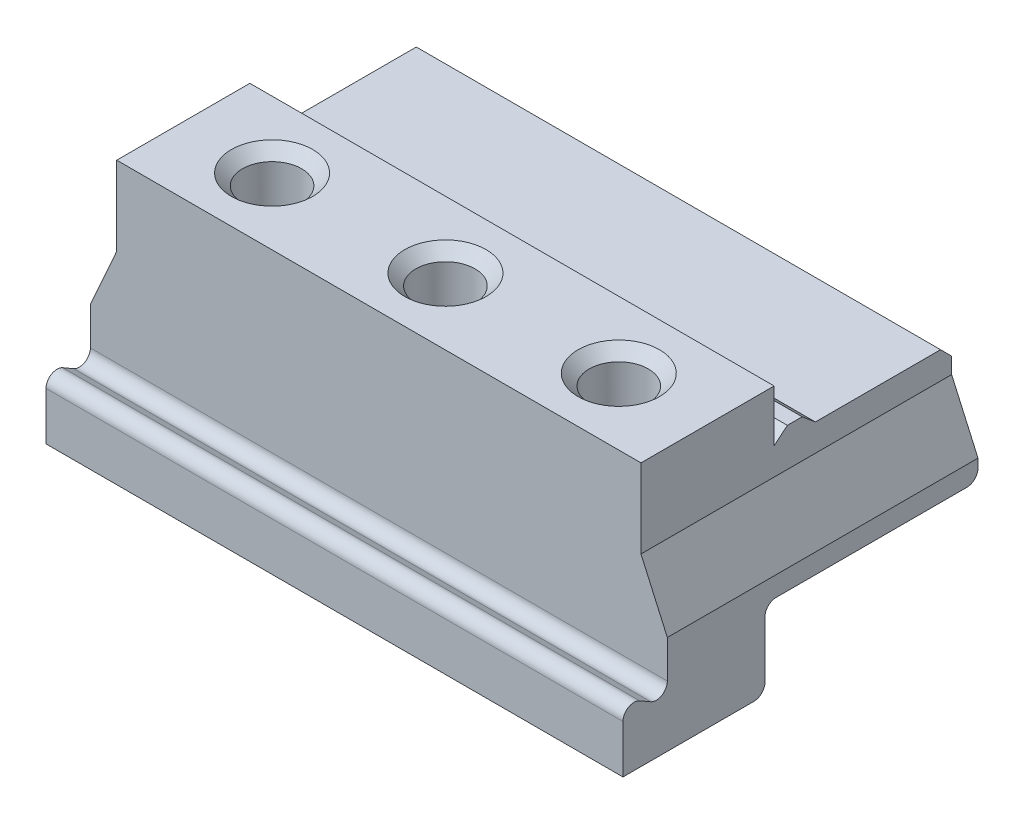
ISO-10303-21;
HEADER;
FILE_DESCRIPTION(('STEP AP214'),'2;1');
FILE_NAME('part.step','',(''),(''),'','','');
FILE_SCHEMA(('AUTOMOTIVE_DESIGN { 1 0 10303 214 1 1 1 1 }'));
ENDSEC;
DATA;
#1=APPLICATION_CONTEXT('core data for automotive mechanical design processes');
#2=APPLICATION_PROTOCOL_DEFINITION('international standard','automotive_design',2000,#1);
#3=PRODUCT_CONTEXT('',#1,'mechanical');
#4=PRODUCT('Part','Part','',(#3));
#5=PRODUCT_RELATED_PRODUCT_CATEGORY('part','',(#4));
#6=PRODUCT_DEFINITION_FORMATION('','',#4);
#7=PRODUCT_DEFINITION_CONTEXT('part definition',#1,'design');
#8=PRODUCT_DEFINITION('design','',#6,#7);
#9=PRODUCT_DEFINITION_SHAPE('','',#8);
#10=(LENGTH_UNIT() NAMED_UNIT(*) SI_UNIT(.MILLI.,.METRE.));
#11=(NAMED_UNIT(*) PLANE_ANGLE_UNIT() SI_UNIT($,.RADIAN.));
#12=(NAMED_UNIT(*) SI_UNIT($,.STERADIAN.) SOLID_ANGLE_UNIT());
#13=UNCERTAINTY_MEASURE_WITH_UNIT(LENGTH_MEASURE(1.E-05),#10,'distance_accuracy_value','');
#14=(GEOMETRIC_REPRESENTATION_CONTEXT(3) GLOBAL_UNCERTAINTY_ASSIGNED_CONTEXT((#13)) GLOBAL_UNIT_ASSIGNED_CONTEXT((#10,
#11,#12)) REPRESENTATION_CONTEXT('',''));
#15=CARTESIAN_POINT('',(0.,0.,0.));
#16=DIRECTION('',(0.,0.,1.));
#17=DIRECTION('',(1.,0.,0.));
#18=AXIS2_PLACEMENT_3D('',#15,#16,#17);
#19=CARTESIAN_POINT('',(0.,32.,-48.));
#20=DIRECTION('',(0.,-1.,0.));
#21=DIRECTION('',(0.,0.,-1.));
#22=AXIS2_PLACEMENT_3D('',#19,#20,#21);
#23=PLANE('',#22);
#24=CARTESIAN_POINT('',(62.4381705175317,32.,-15.));
#25=DIRECTION('',(0.,-1.,0.));
#26=DIRECTION('',(0.,0.,-1.));
#27=AXIS2_PLACEMENT_3D('',#24,#25,#26);
#28=CIRCLE('',#27,5.49999999999998);
#29=CARTESIAN_POINT('',(62.4381705175317,32.,-20.5));
#30=VERTEX_POINT('',#29);
#31=EDGE_CURVE('E286',#30,#30,#28,.T.);
#32=ORIENTED_EDGE('',*,*,#31,.T.);
#33=EDGE_LOOP('',(#32));
#34=FACE_BOUND('',#33,.T.);
#35=CARTESIAN_POINT('',(39.,32.,-15.));
#36=DIRECTION('',(0.,-1.,0.));
#37=DIRECTION('',(0.,0.,-1.));
#38=AXIS2_PLACEMENT_3D('',#35,#36,#37);
#39=CIRCLE('',#38,5.50000000000001);
#40=CARTESIAN_POINT('',(39.,32.,-20.5));
#41=VERTEX_POINT('',#40);
#42=EDGE_CURVE('E284',#41,#41,#39,.T.);
#43=ORIENTED_EDGE('',*,*,#42,.T.);
#44=EDGE_LOOP('',(#43));
#45=FACE_BOUND('',#44,.T.);
#46=CARTESIAN_POINT('',(15.5618294824683,32.,-15.));
#47=DIRECTION('',(0.,-1.,0.));
#48=DIRECTION('',(0.,0.,-1.));
#49=AXIS2_PLACEMENT_3D('',#46,#47,#48);
#50=CIRCLE('',#49,5.50000000000001);
#51=CARTESIAN_POINT('',(15.5618294824683,32.,-20.5));
#52=VERTEX_POINT('',#51);
#53=EDGE_CURVE('E285',#52,#52,#50,.T.);
#54=ORIENTED_EDGE('',*,*,#53,.T.);
#55=EDGE_LOOP('',(#54));
#56=FACE_BOUND('',#55,.T.);
#57=DIRECTION('',(0.,0.,1.));
#58=VECTOR('',#57,1.);
#59=CARTESIAN_POINT('',(3.56182948246827,32.,-48.));
#60=LINE('',#59,#58);
#61=CARTESIAN_POINT('',(3.56182948246827,32.,-24.));
#62=VERTEX_POINT('',#61);
#63=CARTESIAN_POINT('',(3.56182948246827,32.,-6.));
#64=VERTEX_POINT('',#63);
#65=EDGE_CURVE('E252',#62,#64,#60,.T.);
#66=ORIENTED_EDGE('',*,*,#65,.T.);
#67=DIRECTION('',(1.,0.,0.));
#68=VECTOR('',#67,1.);
#69=CARTESIAN_POINT('',(0.,32.,-6.));
#70=LINE('',#69,#68);
#71=CARTESIAN_POINT('',(74.4381705175317,32.,-6.));
#72=VERTEX_POINT('',#71);
#73=EDGE_CURVE('E415',#64,#72,#70,.T.);
#74=ORIENTED_EDGE('',*,*,#73,.T.);
#75=DIRECTION('',(0.,0.,1.));
#76=VECTOR('',#75,1.);
#77=CARTESIAN_POINT('',(74.4381705175317,32.,-48.));
#78=LINE('',#77,#76);
#79=CARTESIAN_POINT('',(74.4381705175317,32.,-24.));
#80=VERTEX_POINT('',#79);
#81=EDGE_CURVE('E251',#80,#72,#78,.T.);
#82=ORIENTED_EDGE('',*,*,#81,.F.);
#83=DIRECTION('',(1.,0.,0.));
#84=VECTOR('',#83,1.);
#85=CARTESIAN_POINT('',(0.,32.,-24.));
#86=LINE('',#85,#84);
#87=EDGE_CURVE('E413',#62,#80,#86,.T.);
#88=ORIENTED_EDGE('',*,*,#87,.F.);
#89=EDGE_LOOP('',(#66,#74,#82,#88));
#90=FACE_BOUND('',#89,.T.);
#91=ADVANCED_FACE('F44',(#34,#45,#56,#90),#23,.F.);
#92=CARTESIAN_POINT('',(0.,9.16666666666667,-20.7));
#93=DIRECTION('',(1.,0.,0.));
#94=DIRECTION('',(0.,0.,-1.));
#95=AXIS2_PLACEMENT_3D('',#92,#93,#94);
#96=CYLINDRICAL_SURFACE('',#95,1.5);
#97=CARTESIAN_POINT('',(78.,9.16666666666667,-20.7));
#98=DIRECTION('',(1.,0.,0.));
#99=DIRECTION('',(0.,0.,-1.));
#100=AXIS2_PLACEMENT_3D('',#97,#98,#99);
#101=CIRCLE('',#100,1.5);
#102=CARTESIAN_POINT('',(78.,9.16666666666667,-19.2));
#103=VERTEX_POINT('',#102);
#104=CARTESIAN_POINT('',(78.,10.6666666666667,-20.7));
#105=VERTEX_POINT('',#104);
#106=EDGE_CURVE('E426',#103,#105,#101,.F.);
#107=ORIENTED_EDGE('',*,*,#106,.F.);
#108=DIRECTION('',(1.,0.,0.));
#109=VECTOR('',#108,1.);
#110=CARTESIAN_POINT('',(0.,9.16666666666667,-19.2));
#111=LINE('',#110,#109);
#112=CARTESIAN_POINT('',(0.,9.16666666666667,-19.2));
#113=VERTEX_POINT('',#112);
#114=EDGE_CURVE('E429',#113,#103,#111,.T.);
#115=ORIENTED_EDGE('',*,*,#114,.F.);
#116=CARTESIAN_POINT('',(0.,9.16666666666667,-20.7));
#117=DIRECTION('',(1.,0.,0.));
#118=DIRECTION('',(0.,0.,-1.));
#119=AXIS2_PLACEMENT_3D('',#116,#117,#118);
#120=CIRCLE('',#119,1.5);
#121=CARTESIAN_POINT('',(0.,10.6666666666667,-20.7));
#122=VERTEX_POINT('',#121);
#123=EDGE_CURVE('E449',#113,#122,#120,.F.);
#124=ORIENTED_EDGE('',*,*,#123,.T.);
#125=DIRECTION('',(1.,0.,0.));
#126=VECTOR('',#125,1.);
#127=CARTESIAN_POINT('',(0.,10.6666666666667,-20.7));
#128=LINE('',#127,#126);
#129=EDGE_CURVE('E445',#122,#105,#128,.T.);
#130=ORIENTED_EDGE('',*,*,#129,.T.);
#131=EDGE_LOOP('',(#107,#115,#124,#130));
#132=FACE_BOUND('',#131,.T.);
#133=ADVANCED_FACE('F313',(#132),#96,.F.);
#134=CARTESIAN_POINT('',(0.,10.6666666666667,0.));
#135=DIRECTION('',(0.,1.,0.));
#136=DIRECTION('',(0.,0.,1.));
#137=AXIS2_PLACEMENT_3D('',#134,#135,#136);
#138=PLANE('',#137);
#139=DIRECTION('',(0.,0.,1.));
#140=VECTOR('',#139,1.);
#141=CARTESIAN_POINT('',(78.,10.6666666666667,0.));
#142=LINE('',#141,#140);
#143=CARTESIAN_POINT('',(78.,10.6666666666667,-46.5));
#144=VERTEX_POINT('',#143);
#145=EDGE_CURVE('E444',#144,#105,#142,.T.);
#146=ORIENTED_EDGE('',*,*,#145,.T.);
#147=ORIENTED_EDGE('',*,*,#129,.F.);
#148=DIRECTION('',(0.,0.,1.));
#149=VECTOR('',#148,1.);
#150=CARTESIAN_POINT('',(0.,10.6666666666667,0.));
#151=LINE('',#150,#149);
#152=CARTESIAN_POINT('',(0.,10.6666666666667,-46.5));
#153=VERTEX_POINT('',#152);
#154=EDGE_CURVE('E433',#153,#122,#151,.T.);
#155=ORIENTED_EDGE('',*,*,#154,.F.);
#156=DIRECTION('',(1.,0.,0.));
#157=VECTOR('',#156,1.);
#158=CARTESIAN_POINT('',(0.,10.6666666666667,-46.5));
#159=LINE('',#158,#157);
#160=EDGE_CURVE('E439',#153,#144,#159,.T.);
#161=ORIENTED_EDGE('',*,*,#160,.T.);
#162=EDGE_LOOP('',(#146,#147,#155,#161));
#163=FACE_BOUND('',#162,.T.);
#164=ADVANCED_FACE('F325',(#163),#138,.F.);
#165=CARTESIAN_POINT('',(0.,12.1666666666667,-46.5));
#166=DIRECTION('',(1.,0.,0.));
#167=DIRECTION('',(0.,0.,-1.));
#168=AXIS2_PLACEMENT_3D('',#165,#166,#167);
#169=CYLINDRICAL_SURFACE('',#168,1.5);
#170=CARTESIAN_POINT('',(78.,12.1666666666667,-46.5));
#171=DIRECTION('',(1.,0.,0.));
#172=DIRECTION('',(0.,0.,-1.));
#173=AXIS2_PLACEMENT_3D('',#170,#171,#172);
#174=CIRCLE('',#173,1.5);
#175=CARTESIAN_POINT('',(78.,12.1666666666667,-48.));
#176=VERTEX_POINT('',#175);
#177=EDGE_CURVE('E446',#144,#176,#174,.T.);
#178=ORIENTED_EDGE('',*,*,#177,.F.);
#179=ORIENTED_EDGE('',*,*,#160,.F.);
#180=CARTESIAN_POINT('',(0.,12.1666666666667,-46.5));
#181=DIRECTION('',(1.,0.,0.));
#182=DIRECTION('',(0.,0.,-1.));
#183=AXIS2_PLACEMENT_3D('',#180,#181,#182);
#184=CIRCLE('',#183,1.5);
#185=CARTESIAN_POINT('',(0.,12.1666666666667,-48.));
#186=VERTEX_POINT('',#185);
#187=EDGE_CURVE('E465',#153,#186,#184,.T.);
#188=ORIENTED_EDGE('',*,*,#187,.T.);
#189=DIRECTION('',(1.,0.,0.));
#190=VECTOR('',#189,1.);
#191=CARTESIAN_POINT('',(0.,12.1666666666667,-48.));
#192=LINE('',#191,#190);
#193=EDGE_CURVE('E438',#186,#176,#192,.T.);
#194=ORIENTED_EDGE('',*,*,#193,.T.);
#195=EDGE_LOOP('',(#178,#179,#188,#194));
#196=FACE_BOUND('',#195,.T.);
#197=ADVANCED_FACE('F531',(#196),#169,.T.);
#198=CARTESIAN_POINT('',(0.,1.5,-17.7));
#199=DIRECTION('',(1.,0.,0.));
#200=DIRECTION('',(0.,0.,-1.));
#201=AXIS2_PLACEMENT_3D('',#198,#199,#200);
#202=CYLINDRICAL_SURFACE('',#201,1.5);
#203=CARTESIAN_POINT('',(78.,1.5,-17.7));
#204=DIRECTION('',(1.,0.,0.));
#205=DIRECTION('',(0.,0.,-1.));
#206=AXIS2_PLACEMENT_3D('',#203,#204,#205);
#207=CIRCLE('',#206,1.5);
#208=CARTESIAN_POINT('',(78.,0.,-17.7));
#209=VERTEX_POINT('',#208);
#210=CARTESIAN_POINT('',(78.,1.5,-19.2));
#211=VERTEX_POINT('',#210);
#212=EDGE_CURVE('E455',#209,#211,#207,.T.);
#213=ORIENTED_EDGE('',*,*,#212,.F.);
#214=DIRECTION('',(1.,0.,0.));
#215=VECTOR('',#214,1.);
#216=CARTESIAN_POINT('',(0.,0.,-17.7));
#217=LINE('',#216,#215);
#218=CARTESIAN_POINT('',(0.,0.,-17.7));
#219=VERTEX_POINT('',#218);
#220=EDGE_CURVE('E434',#219,#209,#217,.T.);
#221=ORIENTED_EDGE('',*,*,#220,.F.);
#222=CARTESIAN_POINT('',(0.,1.5,-17.7));
#223=DIRECTION('',(1.,0.,0.));
#224=DIRECTION('',(0.,0.,-1.));
#225=AXIS2_PLACEMENT_3D('',#222,#223,#224);
#226=CIRCLE('',#225,1.5);
#227=CARTESIAN_POINT('',(0.,1.5,-19.2));
#228=VERTEX_POINT('',#227);
#229=EDGE_CURVE('E464',#219,#228,#226,.T.);
#230=ORIENTED_EDGE('',*,*,#229,.T.);
#231=DIRECTION('',(1.,0.,0.));
#232=VECTOR('',#231,1.);
#233=CARTESIAN_POINT('',(0.,1.5,-19.2));
#234=LINE('',#233,#232);
#235=EDGE_CURVE('E435',#228,#211,#234,.T.);
#236=ORIENTED_EDGE('',*,*,#235,.T.);
#237=EDGE_LOOP('',(#213,#221,#230,#236));
#238=FACE_BOUND('',#237,.T.);
#239=ADVANCED_FACE('F540',(#238),#202,.T.);
#240=CARTESIAN_POINT('',(0.,0.,-19.2));
#241=DIRECTION('',(0.,0.,1.));
#242=DIRECTION('',(0.,-1.,0.));
#243=AXIS2_PLACEMENT_3D('',#240,#241,#242);
#244=PLANE('',#243);
#245=DIRECTION('',(0.,-1.,0.));
#246=VECTOR('',#245,1.);
#247=CARTESIAN_POINT('',(78.,0.,-19.2));
#248=LINE('',#247,#246);
#249=EDGE_CURVE('E453',#103,#211,#248,.T.);
#250=ORIENTED_EDGE('',*,*,#249,.T.);
#251=ORIENTED_EDGE('',*,*,#235,.F.);
#252=DIRECTION('',(0.,-1.,0.));
#253=VECTOR('',#252,1.);
#254=CARTESIAN_POINT('',(0.,0.,-19.2));
#255=LINE('',#254,#253);
#256=EDGE_CURVE('E467',#113,#228,#255,.T.);
#257=ORIENTED_EDGE('',*,*,#256,.F.);
#258=ORIENTED_EDGE('',*,*,#114,.T.);
#259=EDGE_LOOP('',(#250,#251,#257,#258));
#260=FACE_BOUND('',#259,.T.);
#261=ADVANCED_FACE('F348',(#260),#244,.F.);
#262=CARTESIAN_POINT('',(0.,0.,-48.));
#263=DIRECTION('',(1.,0.,0.));
#264=DIRECTION('',(0.,0.,-1.));
#265=AXIS2_PLACEMENT_3D('',#262,#263,#264);
#266=PLANE('',#265);
#267=CARTESIAN_POINT('',(0.,8.23205080756887,-4.5));
#268=DIRECTION('',(1.,0.,0.));
#269=DIRECTION('',(0.,0.,-1.));
#270=AXIS2_PLACEMENT_3D('',#267,#268,#269);
#271=CIRCLE('',#270,1.5);
#272=CARTESIAN_POINT('',(0.,6.93301270189222,-3.74999999999999));
#273=VERTEX_POINT('',#272);
#274=CARTESIAN_POINT('',(0.,8.23205080756887,-6.));
#275=VERTEX_POINT('',#274);
#276=EDGE_CURVE('E487',#273,#275,#271,.T.);
#277=ORIENTED_EDGE('',*,*,#276,.T.);
#278=DIRECTION('',(0.,1.,0.));
#279=VECTOR('',#278,1.);
#280=CARTESIAN_POINT('',(0.,0.,-6.));
#281=LINE('',#280,#279);
#282=CARTESIAN_POINT('',(0.,13.3333333333333,-6.));
#283=VERTEX_POINT('',#282);
#284=EDGE_CURVE('E224',#275,#283,#281,.T.);
#285=ORIENTED_EDGE('',*,*,#284,.T.);
#286=DIRECTION('',(0.,0.,1.));
#287=VECTOR('',#286,1.);
#288=CARTESIAN_POINT('',(0.,13.3333333333333,-48.));
#289=LINE('',#288,#287);
#290=CARTESIAN_POINT('',(0.,13.3333333333333,-48.));
#291=VERTEX_POINT('',#290);
#292=EDGE_CURVE('E242',#291,#283,#289,.T.);
#293=ORIENTED_EDGE('',*,*,#292,.F.);
#294=DIRECTION('',(0.,1.,0.));
#295=VECTOR('',#294,1.);
#296=CARTESIAN_POINT('',(0.,0.,-48.));
#297=LINE('',#296,#295);
#298=EDGE_CURVE('E243',#186,#291,#297,.T.);
#299=ORIENTED_EDGE('',*,*,#298,.F.);
#300=ORIENTED_EDGE('',*,*,#187,.F.);
#301=ORIENTED_EDGE('',*,*,#154,.T.);
#302=ORIENTED_EDGE('',*,*,#123,.F.);
#303=ORIENTED_EDGE('',*,*,#256,.T.);
#304=ORIENTED_EDGE('',*,*,#229,.F.);
#305=DIRECTION('',(0.,0.,1.));
#306=VECTOR('',#305,1.);
#307=CARTESIAN_POINT('',(0.,0.,-48.));
#308=LINE('',#307,#306);
#309=CARTESIAN_POINT('',(0.,0.,0.));
#310=VERTEX_POINT('',#309);
#311=EDGE_CURVE('E229',#219,#310,#308,.T.);
#312=ORIENTED_EDGE('',*,*,#311,.T.);
#313=DIRECTION('',(0.,1.,0.));
#314=VECTOR('',#313,1.);
#315=CARTESIAN_POINT('',(0.,0.,0.));
#316=LINE('',#315,#314);
#317=CARTESIAN_POINT('',(0.,6.5,0.));
#318=VERTEX_POINT('',#317);
#319=EDGE_CURVE('E219',#310,#318,#316,.T.);
#320=ORIENTED_EDGE('',*,*,#319,.T.);
#321=CARTESIAN_POINT('',(0.,6.5,-1.5));
#322=DIRECTION('',(1.,0.,0.));
#323=DIRECTION('',(0.,0.,-1.));
#324=AXIS2_PLACEMENT_3D('',#321,#322,#323);
#325=CIRCLE('',#324,1.5);
#326=CARTESIAN_POINT('',(0.,7.79903810567665,-2.25000000000001));
#327=VERTEX_POINT('',#326);
#328=EDGE_CURVE('E203',#318,#327,#325,.F.);
#329=ORIENTED_EDGE('',*,*,#328,.T.);
#330=DIRECTION('',(0.,-0.500000000000004,-0.866025403784437));
#331=VECTOR('',#330,1.);
#332=CARTESIAN_POINT('',(0.,6.82355715851496,-3.93958256229945));
#333=LINE('',#332,#331);
#334=EDGE_CURVE('E215',#327,#273,#333,.T.);
#335=ORIENTED_EDGE('',*,*,#334,.T.);
#336=EDGE_LOOP('',(#277,#285,#293,#299,#300,#301,#302,#303,#304,#312,#320,#329,#335));
#337=FACE_BOUND('',#336,.T.);
#338=ADVANCED_FACE('F227',(#337),#266,.F.);
#339=CARTESIAN_POINT('',(78.,0.,-48.));
#340=DIRECTION('',(1.,0.,0.));
#341=DIRECTION('',(0.,0.,-1.));
#342=AXIS2_PLACEMENT_3D('',#339,#340,#341);
#343=PLANE('',#342);
#344=CARTESIAN_POINT('',(78.,6.5,-1.5));
#345=DIRECTION('',(1.,0.,0.));
#346=DIRECTION('',(0.,0.,-1.));
#347=AXIS2_PLACEMENT_3D('',#344,#345,#346);
#348=CIRCLE('',#347,1.5);
#349=CARTESIAN_POINT('',(78.,6.5,0.));
#350=VERTEX_POINT('',#349);
#351=CARTESIAN_POINT('',(78.,7.79903810567665,-2.25000000000001));
#352=VERTEX_POINT('',#351);
#353=EDGE_CURVE('E443',#350,#352,#348,.F.);
#354=ORIENTED_EDGE('',*,*,#353,.F.);
#355=DIRECTION('',(0.,1.,0.));
#356=VECTOR('',#355,1.);
#357=CARTESIAN_POINT('',(78.,0.,0.));
#358=LINE('',#357,#356);
#359=CARTESIAN_POINT('',(78.,0.,0.));
#360=VERTEX_POINT('',#359);
#361=EDGE_CURVE('E221',#360,#350,#358,.T.);
#362=ORIENTED_EDGE('',*,*,#361,.F.);
#363=DIRECTION('',(0.,0.,1.));
#364=VECTOR('',#363,1.);
#365=CARTESIAN_POINT('',(78.,0.,-48.));
#366=LINE('',#365,#364);
#367=EDGE_CURVE('E263',#209,#360,#366,.T.);
#368=ORIENTED_EDGE('',*,*,#367,.F.);
#369=ORIENTED_EDGE('',*,*,#212,.T.);
#370=ORIENTED_EDGE('',*,*,#249,.F.);
#371=ORIENTED_EDGE('',*,*,#106,.T.);
#372=ORIENTED_EDGE('',*,*,#145,.F.);
#373=ORIENTED_EDGE('',*,*,#177,.T.);
#374=DIRECTION('',(0.,1.,0.));
#375=VECTOR('',#374,1.);
#376=CARTESIAN_POINT('',(78.,0.,-48.));
#377=LINE('',#376,#375);
#378=CARTESIAN_POINT('',(78.,13.3333333333333,-48.));
#379=VERTEX_POINT('',#378);
#380=EDGE_CURVE('E388',#176,#379,#377,.T.);
#381=ORIENTED_EDGE('',*,*,#380,.T.);
#382=DIRECTION('',(0.,0.,1.));
#383=VECTOR('',#382,1.);
#384=CARTESIAN_POINT('',(78.,13.3333333333333,-48.));
#385=LINE('',#384,#383);
#386=CARTESIAN_POINT('',(78.,13.3333333333333,-6.));
#387=VERTEX_POINT('',#386);
#388=EDGE_CURVE('E258',#379,#387,#385,.T.);
#389=ORIENTED_EDGE('',*,*,#388,.T.);
#390=DIRECTION('',(0.,1.,0.));
#391=VECTOR('',#390,1.);
#392=CARTESIAN_POINT('',(78.,0.,-6.));
#393=LINE('',#392,#391);
#394=CARTESIAN_POINT('',(78.,8.23205080756887,-6.));
#395=VERTEX_POINT('',#394);
#396=EDGE_CURVE('E214',#395,#387,#393,.T.);
#397=ORIENTED_EDGE('',*,*,#396,.F.);
#398=CARTESIAN_POINT('',(78.,8.23205080756887,-4.5));
#399=DIRECTION('',(1.,0.,0.));
#400=DIRECTION('',(0.,0.,-1.));
#401=AXIS2_PLACEMENT_3D('',#398,#399,#400);
#402=CIRCLE('',#401,1.5);
#403=CARTESIAN_POINT('',(78.,6.93301270189222,-3.74999999999999));
#404=VERTEX_POINT('',#403);
#405=EDGE_CURVE('E478',#404,#395,#402,.T.);
#406=ORIENTED_EDGE('',*,*,#405,.F.);
#407=DIRECTION('',(0.,-0.500000000000004,-0.866025403784437));
#408=VECTOR('',#407,1.);
#409=CARTESIAN_POINT('',(78.,6.82355715851496,-3.93958256229945));
#410=LINE('',#409,#408);
#411=EDGE_CURVE('E483',#352,#404,#410,.T.);
#412=ORIENTED_EDGE('',*,*,#411,.F.);
#413=EDGE_LOOP('',(#354,#362,#368,#369,#370,#371,#372,#373,#381,#389,#397,#406,#412));
#414=FACE_BOUND('',#413,.T.);
#415=ADVANCED_FACE('F340',(#414),#343,.T.);
#416=CARTESIAN_POINT('',(0.,0.,-48.));
#417=DIRECTION('',(0.,-1.,0.));
#418=DIRECTION('',(0.,0.,-1.));
#419=AXIS2_PLACEMENT_3D('',#416,#417,#418);
#420=PLANE('',#419);
#421=ORIENTED_EDGE('',*,*,#311,.F.);
#422=ORIENTED_EDGE('',*,*,#220,.T.);
#423=ORIENTED_EDGE('',*,*,#367,.T.);
#424=DIRECTION('',(1.,0.,0.));
#425=VECTOR('',#424,1.);
#426=CARTESIAN_POINT('',(0.,0.,0.));
#427=LINE('',#426,#425);
#428=EDGE_CURVE('E233',#310,#360,#427,.T.);
#429=ORIENTED_EDGE('',*,*,#428,.F.);
#430=EDGE_LOOP('',(#421,#422,#423,#429));
#431=FACE_BOUND('',#430,.T.);
#432=ADVANCED_FACE('F338',(#431),#420,.T.);
#433=CARTESIAN_POINT('',(0.,0.,-48.));
#434=DIRECTION('',(0.,0.,1.));
#435=DIRECTION('',(1.,0.,0.));
#436=AXIS2_PLACEMENT_3D('',#433,#434,#435);
#437=PLANE('',#436);
#438=DIRECTION('',(0.,1.,0.));
#439=VECTOR('',#438,1.);
#440=CARTESIAN_POINT('',(3.56182948246826,0.,-48.));
#441=LINE('',#440,#439);
#442=CARTESIAN_POINT('',(3.56182948246827,21.3333333333333,-48.));
#443=VERTEX_POINT('',#442);
#444=CARTESIAN_POINT('',(3.56182948246827,23.5,-48.));
#445=VERTEX_POINT('',#444);
#446=EDGE_CURVE('E377',#443,#445,#441,.T.);
#447=ORIENTED_EDGE('',*,*,#446,.T.);
#448=DIRECTION('',(1.,0.,0.));
#449=VECTOR('',#448,1.);
#450=CARTESIAN_POINT('',(0.,23.5,-48.));
#451=LINE('',#450,#449);
#452=CARTESIAN_POINT('',(74.4381705175317,23.5,-48.));
#453=VERTEX_POINT('',#452);
#454=EDGE_CURVE('E273',#445,#453,#451,.T.);
#455=ORIENTED_EDGE('',*,*,#454,.T.);
#456=DIRECTION('',(0.,1.,0.));
#457=VECTOR('',#456,1.);
#458=CARTESIAN_POINT('',(74.4381705175317,0.,-48.));
#459=LINE('',#458,#457);
#460=CARTESIAN_POINT('',(74.4381705175317,21.3333333333333,-48.));
#461=VERTEX_POINT('',#460);
#462=EDGE_CURVE('E381',#461,#453,#459,.T.);
#463=ORIENTED_EDGE('',*,*,#462,.F.);
#464=DIRECTION('',(-0.406736643075799,0.913545457642601,0.));
#465=VECTOR('',#464,1.);
#466=CARTESIAN_POINT('',(70.0503924845115,31.1884441512259,-48.));
#467=LINE('',#466,#465);
#468=EDGE_CURVE('E383',#379,#461,#467,.T.);
#469=ORIENTED_EDGE('',*,*,#468,.F.);
#470=ORIENTED_EDGE('',*,*,#380,.F.);
#471=ORIENTED_EDGE('',*,*,#193,.F.);
#472=ORIENTED_EDGE('',*,*,#298,.T.);
#473=DIRECTION('',(0.406736643075798,0.913545457642602,0.));
#474=VECTOR('',#473,1.);
#475=CARTESIAN_POINT('',(-4.95429883651594,2.20579595760759,-48.));
#476=LINE('',#475,#474);
#477=EDGE_CURVE('E237',#291,#443,#476,.T.);
#478=ORIENTED_EDGE('',*,*,#477,.T.);
#479=EDGE_LOOP('',(#447,#455,#463,#469,#470,#471,#472,#478));
#480=FACE_BOUND('',#479,.T.);
#481=ADVANCED_FACE('F341',(#480),#437,.F.);
#482=CARTESIAN_POINT('',(-4.95429883651594,2.20579595760759,-48.));
#483=DIRECTION('',(0.913545457642602,-0.406736643075798,0.));
#484=DIRECTION('',(0.406736643075798,0.913545457642602,0.));
#485=AXIS2_PLACEMENT_3D('',#482,#483,#484);
#486=PLANE('',#485);
#487=ORIENTED_EDGE('',*,*,#292,.T.);
#488=DIRECTION('',(0.406736643075798,0.913545457642602,0.));
#489=VECTOR('',#488,1.);
#490=CARTESIAN_POINT('',(-4.95429883651594,2.20579595760759,-6.));
#491=LINE('',#490,#489);
#492=CARTESIAN_POINT('',(3.56182948246827,21.3333333333333,-6.));
#493=VERTEX_POINT('',#492);
#494=EDGE_CURVE('E402',#283,#493,#491,.T.);
#495=ORIENTED_EDGE('',*,*,#494,.T.);
#496=DIRECTION('',(0.,0.,1.));
#497=VECTOR('',#496,1.);
#498=CARTESIAN_POINT('',(3.56182948246827,21.3333333333333,-48.));
#499=LINE('',#498,#497);
#500=EDGE_CURVE('E247',#443,#493,#499,.T.);
#501=ORIENTED_EDGE('',*,*,#500,.F.);
#502=ORIENTED_EDGE('',*,*,#477,.F.);
#503=EDGE_LOOP('',(#487,#495,#501,#502));
#504=FACE_BOUND('',#503,.T.);
#505=ADVANCED_FACE('F561',(#504),#486,.F.);
#506=CARTESIAN_POINT('',(3.56182948246826,0.,-48.));
#507=DIRECTION('',(1.,0.,0.));
#508=DIRECTION('',(0.,1.,0.));
#509=AXIS2_PLACEMENT_3D('',#506,#507,#508);
#510=PLANE('',#509);
#511=DIRECTION('',(0.,0.,-1.));
#512=VECTOR('',#511,1.);
#513=CARTESIAN_POINT('',(3.56182948246827,25.,-48.));
#514=LINE('',#513,#512);
#515=CARTESIAN_POINT('',(3.56182948246827,25.,-29.5752607777826));
#516=VERTEX_POINT('',#515);
#517=CARTESIAN_POINT('',(3.56182948246827,25.,-46.5));
#518=VERTEX_POINT('',#517);
#519=EDGE_CURVE('E378',#516,#518,#514,.T.);
#520=ORIENTED_EDGE('',*,*,#519,.T.);
#521=DIRECTION('',(0.,0.707106781186548,0.707106781186548));
#522=VECTOR('',#521,1.);
#523=CARTESIAN_POINT('',(3.56182948246827,23.5,-48.));
#524=LINE('',#523,#522);
#525=EDGE_CURVE('E278',#518,#445,#524,.F.);
#526=ORIENTED_EDGE('',*,*,#525,.T.);
#527=ORIENTED_EDGE('',*,*,#446,.F.);
#528=ORIENTED_EDGE('',*,*,#500,.T.);
#529=DIRECTION('',(0.,1.,0.));
#530=VECTOR('',#529,1.);
#531=CARTESIAN_POINT('',(3.56182948246826,0.,-6.));
#532=LINE('',#531,#530);
#533=EDGE_CURVE('E404',#493,#64,#532,.T.);
#534=ORIENTED_EDGE('',*,*,#533,.T.);
#535=ORIENTED_EDGE('',*,*,#65,.F.);
#536=DIRECTION('',(0.,-1.,0.));
#537=VECTOR('',#536,1.);
#538=CARTESIAN_POINT('',(3.56182948246826,0.,-24.));
#539=LINE('',#538,#537);
#540=CARTESIAN_POINT('',(3.56182948246827,25.,-24.));
#541=VERTEX_POINT('',#540);
#542=EDGE_CURVE('E396',#62,#541,#539,.T.);
#543=ORIENTED_EDGE('',*,*,#542,.T.);
#544=DIRECTION('',(0.,0.642787609686541,-0.766044443118976));
#545=VECTOR('',#544,1.);
#546=CARTESIAN_POINT('',(3.56182948246827,26.4882952569831,-25.7736812193505));
#547=LINE('',#546,#545);
#548=CARTESIAN_POINT('',(3.56182948246827,26.5,-25.7876303888913));
#549=VERTEX_POINT('',#548);
#550=EDGE_CURVE('E394',#541,#549,#547,.T.);
#551=ORIENTED_EDGE('',*,*,#550,.T.);
#552=DIRECTION('',(0.,0.,-1.));
#553=VECTOR('',#552,1.);
#554=CARTESIAN_POINT('',(3.56182948246827,26.5,-48.));
#555=LINE('',#554,#553);
#556=CARTESIAN_POINT('',(3.56182948246827,26.5,-27.7876303888913));
#557=VERTEX_POINT('',#556);
#558=EDGE_CURVE('E236',#549,#557,#555,.T.);
#559=ORIENTED_EDGE('',*,*,#558,.T.);
#560=DIRECTION('',(0.,-0.642787609686541,-0.766044443118976));
#561=VECTOR('',#560,1.);
#562=CARTESIAN_POINT('',(3.56182948246826,5.59818920420265,-52.6974384965071));
#563=LINE('',#562,#561);
#564=EDGE_CURVE('E235',#557,#516,#563,.T.);
#565=ORIENTED_EDGE('',*,*,#564,.T.);
#566=EDGE_LOOP('',(#520,#526,#527,#528,#534,#535,#543,#551,#559,#565));
#567=FACE_BOUND('',#566,.T.);
#568=ADVANCED_FACE('F328',(#567),#510,.F.);
#569=CARTESIAN_POINT('',(74.4381705175317,0.,-48.));
#570=DIRECTION('',(1.,0.,0.));
#571=DIRECTION('',(0.,0.,-1.));
#572=AXIS2_PLACEMENT_3D('',#569,#570,#571);
#573=PLANE('',#572);
#574=ORIENTED_EDGE('',*,*,#462,.T.);
#575=DIRECTION('',(0.,-0.707106781186548,-0.707106781186548));
#576=VECTOR('',#575,1.);
#577=CARTESIAN_POINT('',(74.4381705175317,11.75,-59.75));
#578=LINE('',#577,#576);
#579=CARTESIAN_POINT('',(74.4381705175317,25.,-46.5));
#580=VERTEX_POINT('',#579);
#581=EDGE_CURVE('E67',#453,#580,#578,.F.);
#582=ORIENTED_EDGE('',*,*,#581,.T.);
#583=DIRECTION('',(0.,0.,-1.));
#584=VECTOR('',#583,1.);
#585=CARTESIAN_POINT('',(74.4381705175317,25.,-48.));
#586=LINE('',#585,#584);
#587=CARTESIAN_POINT('',(74.4381705175317,25.,-29.5752607777826));
#588=VERTEX_POINT('',#587);
#589=EDGE_CURVE('E408',#588,#580,#586,.T.);
#590=ORIENTED_EDGE('',*,*,#589,.F.);
#591=DIRECTION('',(0.,-0.642787609686541,-0.766044443118976));
#592=VECTOR('',#591,1.);
#593=CARTESIAN_POINT('',(74.4381705175317,5.59818920420265,-52.6974384965071));
#594=LINE('',#593,#592);
#595=CARTESIAN_POINT('',(74.4381705175317,26.5,-27.7876303888913));
#596=VERTEX_POINT('',#595);
#597=EDGE_CURVE('E271',#596,#588,#594,.T.);
#598=ORIENTED_EDGE('',*,*,#597,.F.);
#599=DIRECTION('',(0.,0.,-1.));
#600=VECTOR('',#599,1.);
#601=CARTESIAN_POINT('',(74.4381705175317,26.5,-48.));
#602=LINE('',#601,#600);
#603=CARTESIAN_POINT('',(74.4381705175317,26.5,-25.7876303888913));
#604=VERTEX_POINT('',#603);
#605=EDGE_CURVE('E272',#604,#596,#602,.T.);
#606=ORIENTED_EDGE('',*,*,#605,.F.);
#607=DIRECTION('',(0.,0.642787609686541,-0.766044443118976));
#608=VECTOR('',#607,1.);
#609=CARTESIAN_POINT('',(74.4381705175317,26.4882952569831,-25.7736812193505));
#610=LINE('',#609,#608);
#611=CARTESIAN_POINT('',(74.4381705175317,25.,-24.));
#612=VERTEX_POINT('',#611);
#613=EDGE_CURVE('E269',#612,#604,#610,.T.);
#614=ORIENTED_EDGE('',*,*,#613,.F.);
#615=DIRECTION('',(0.,-1.,0.));
#616=VECTOR('',#615,1.);
#617=CARTESIAN_POINT('',(74.4381705175317,0.,-24.));
#618=LINE('',#617,#616);
#619=EDGE_CURVE('E270',#80,#612,#618,.T.);
#620=ORIENTED_EDGE('',*,*,#619,.F.);
#621=ORIENTED_EDGE('',*,*,#81,.T.);
#622=DIRECTION('',(0.,1.,0.));
#623=VECTOR('',#622,1.);
#624=CARTESIAN_POINT('',(74.4381705175317,0.,-6.));
#625=LINE('',#624,#623);
#626=CARTESIAN_POINT('',(74.4381705175317,21.3333333333333,-6.));
#627=VERTEX_POINT('',#626);
#628=EDGE_CURVE('E410',#627,#72,#625,.T.);
#629=ORIENTED_EDGE('',*,*,#628,.F.);
#630=DIRECTION('',(0.,0.,1.));
#631=VECTOR('',#630,1.);
#632=CARTESIAN_POINT('',(74.4381705175317,21.3333333333333,-48.));
#633=LINE('',#632,#631);
#634=EDGE_CURVE('E260',#461,#627,#633,.T.);
#635=ORIENTED_EDGE('',*,*,#634,.F.);
#636=EDGE_LOOP('',(#574,#582,#590,#598,#606,#614,#620,#621,#629,#635));
#637=FACE_BOUND('',#636,.T.);
#638=ADVANCED_FACE('F329',(#637),#573,.T.);
#639=CARTESIAN_POINT('',(70.0503924845115,31.1884441512259,-48.));
#640=DIRECTION('',(0.913545457642602,0.406736643075799,0.));
#641=DIRECTION('',(-0.406736643075799,0.913545457642602,0.));
#642=AXIS2_PLACEMENT_3D('',#639,#640,#641);
#643=PLANE('',#642);
#644=DIRECTION('',(-0.406736643075799,0.913545457642602,0.));
#645=VECTOR('',#644,1.);
#646=CARTESIAN_POINT('',(70.0503924845115,31.1884441512259,-6.));
#647=LINE('',#646,#645);
#648=EDGE_CURVE('E250',#387,#627,#647,.T.);
#649=ORIENTED_EDGE('',*,*,#648,.F.);
#650=ORIENTED_EDGE('',*,*,#388,.F.);
#651=ORIENTED_EDGE('',*,*,#468,.T.);
#652=ORIENTED_EDGE('',*,*,#634,.T.);
#653=EDGE_LOOP('',(#649,#650,#651,#652));
#654=FACE_BOUND('',#653,.T.);
#655=ADVANCED_FACE('F331',(#654),#643,.T.);
#656=CARTESIAN_POINT('',(0.,0.,0.));
#657=DIRECTION('',(0.,0.,1.));
#658=DIRECTION('',(1.,0.,0.));
#659=AXIS2_PLACEMENT_3D('',#656,#657,#658);
#660=PLANE('',#659);
#661=DIRECTION('',(1.,0.,0.));
#662=VECTOR('',#661,1.);
#663=CARTESIAN_POINT('',(0.,6.5,0.));
#664=LINE('',#663,#662);
#665=EDGE_CURVE('E204',#318,#350,#664,.T.);
#666=ORIENTED_EDGE('',*,*,#665,.F.);
#667=ORIENTED_EDGE('',*,*,#319,.F.);
#668=ORIENTED_EDGE('',*,*,#428,.T.);
#669=ORIENTED_EDGE('',*,*,#361,.T.);
#670=EDGE_LOOP('',(#666,#667,#668,#669));
#671=FACE_BOUND('',#670,.T.);
#672=ADVANCED_FACE('F218',(#671),#660,.T.);
#673=CARTESIAN_POINT('',(0.,0.,-6.));
#674=DIRECTION('',(0.,0.,-1.));
#675=DIRECTION('',(0.,1.,0.));
#676=AXIS2_PLACEMENT_3D('',#673,#674,#675);
#677=PLANE('',#676);
#678=ORIENTED_EDGE('',*,*,#284,.F.);
#679=DIRECTION('',(1.,0.,0.));
#680=VECTOR('',#679,1.);
#681=CARTESIAN_POINT('',(0.,8.23205080756887,-6.));
#682=LINE('',#681,#680);
#683=EDGE_CURVE('E474',#275,#395,#682,.T.);
#684=ORIENTED_EDGE('',*,*,#683,.T.);
#685=ORIENTED_EDGE('',*,*,#396,.T.);
#686=ORIENTED_EDGE('',*,*,#648,.T.);
#687=ORIENTED_EDGE('',*,*,#628,.T.);
#688=ORIENTED_EDGE('',*,*,#73,.F.);
#689=ORIENTED_EDGE('',*,*,#533,.F.);
#690=ORIENTED_EDGE('',*,*,#494,.F.);
#691=EDGE_LOOP('',(#678,#684,#685,#686,#687,#688,#689,#690));
#692=FACE_BOUND('',#691,.T.);
#693=ADVANCED_FACE('F517',(#692),#677,.F.);
#694=CARTESIAN_POINT('',(0.,8.23205080756887,-4.5));
#695=DIRECTION('',(1.,0.,0.));
#696=DIRECTION('',(0.,0.,-1.));
#697=AXIS2_PLACEMENT_3D('',#694,#695,#696);
#698=CYLINDRICAL_SURFACE('',#697,1.5);
#699=ORIENTED_EDGE('',*,*,#405,.T.);
#700=ORIENTED_EDGE('',*,*,#683,.F.);
#701=ORIENTED_EDGE('',*,*,#276,.F.);
#702=DIRECTION('',(1.,0.,0.));
#703=VECTOR('',#702,1.);
#704=CARTESIAN_POINT('',(0.,6.93301270189222,-3.74999999999999));
#705=LINE('',#704,#703);
#706=EDGE_CURVE('E472',#273,#404,#705,.T.);
#707=ORIENTED_EDGE('',*,*,#706,.T.);
#708=EDGE_LOOP('',(#699,#700,#701,#707));
#709=FACE_BOUND('',#708,.T.);
#710=ADVANCED_FACE('F516',(#709),#698,.F.);
#711=CARTESIAN_POINT('',(0.,6.82355715851496,-3.93958256229945));
#712=DIRECTION('',(0.,-0.866025403784437,0.500000000000004));
#713=DIRECTION('',(0.,-0.500000000000004,-0.866025403784437));
#714=AXIS2_PLACEMENT_3D('',#711,#712,#713);
#715=PLANE('',#714);
#716=ORIENTED_EDGE('',*,*,#411,.T.);
#717=ORIENTED_EDGE('',*,*,#706,.F.);
#718=ORIENTED_EDGE('',*,*,#334,.F.);
#719=DIRECTION('',(1.,0.,0.));
#720=VECTOR('',#719,1.);
#721=CARTESIAN_POINT('',(0.,7.79903810567665,-2.25000000000001));
#722=LINE('',#721,#720);
#723=EDGE_CURVE('E210',#327,#352,#722,.T.);
#724=ORIENTED_EDGE('',*,*,#723,.T.);
#725=EDGE_LOOP('',(#716,#717,#718,#724));
#726=FACE_BOUND('',#725,.T.);
#727=ADVANCED_FACE('F523',(#726),#715,.F.);
#728=CARTESIAN_POINT('',(0.,6.5,-1.5));
#729=DIRECTION('',(1.,0.,0.));
#730=DIRECTION('',(0.,0.,-1.));
#731=AXIS2_PLACEMENT_3D('',#728,#729,#730);
#732=CYLINDRICAL_SURFACE('',#731,1.5);
#733=ORIENTED_EDGE('',*,*,#353,.T.);
#734=ORIENTED_EDGE('',*,*,#723,.F.);
#735=ORIENTED_EDGE('',*,*,#328,.F.);
#736=ORIENTED_EDGE('',*,*,#665,.T.);
#737=EDGE_LOOP('',(#733,#734,#735,#736));
#738=FACE_BOUND('',#737,.T.);
#739=ADVANCED_FACE('F201',(#738),#732,.T.);
#740=CARTESIAN_POINT('',(0.,29.2335752764957,-24.5298822325009));
#741=DIRECTION('',(0.,-0.766044443118976,0.642787609686541));
#742=DIRECTION('',(0.,-0.642787609686541,-0.766044443118976));
#743=AXIS2_PLACEMENT_3D('',#740,#741,#742);
#744=PLANE('',#743);
#745=DIRECTION('',(1.,0.,0.));
#746=VECTOR('',#745,1.);
#747=CARTESIAN_POINT('',(0.,26.5,-27.7876303888913));
#748=LINE('',#747,#746);
#749=EDGE_CURVE('E422',#557,#596,#748,.T.);
#750=ORIENTED_EDGE('',*,*,#749,.T.);
#751=ORIENTED_EDGE('',*,*,#597,.T.);
#752=DIRECTION('',(1.,0.,0.));
#753=VECTOR('',#752,1.);
#754=CARTESIAN_POINT('',(0.,25.,-29.5752607777826));
#755=LINE('',#754,#753);
#756=EDGE_CURVE('E424',#516,#588,#755,.T.);
#757=ORIENTED_EDGE('',*,*,#756,.F.);
#758=ORIENTED_EDGE('',*,*,#564,.F.);
#759=EDGE_LOOP('',(#750,#751,#757,#758));
#760=FACE_BOUND('',#759,.T.);
#761=ADVANCED_FACE('F527',(#760),#744,.F.);
#762=CARTESIAN_POINT('',(0.,26.5,0.));
#763=DIRECTION('',(0.,-1.,0.));
#764=DIRECTION('',(0.,0.,-1.));
#765=AXIS2_PLACEMENT_3D('',#762,#763,#764);
#766=PLANE('',#765);
#767=DIRECTION('',(1.,0.,0.));
#768=VECTOR('',#767,1.);
#769=CARTESIAN_POINT('',(0.,26.5,-25.7876303888913));
#770=LINE('',#769,#768);
#771=EDGE_CURVE('E419',#549,#604,#770,.T.);
#772=ORIENTED_EDGE('',*,*,#771,.T.);
#773=ORIENTED_EDGE('',*,*,#605,.T.);
#774=ORIENTED_EDGE('',*,*,#749,.F.);
#775=ORIENTED_EDGE('',*,*,#558,.F.);
#776=EDGE_LOOP('',(#772,#773,#774,#775));
#777=FACE_BOUND('',#776,.T.);
#778=ADVANCED_FACE('F550',(#777),#766,.F.);
#779=CARTESIAN_POINT('',(0.,2.85290918469006,2.39387504465571));
#780=DIRECTION('',(0.,-0.766044443118976,-0.642787609686541));
#781=DIRECTION('',(0.,0.642787609686541,-0.766044443118976));
#782=AXIS2_PLACEMENT_3D('',#779,#780,#781);
#783=PLANE('',#782);
#784=DIRECTION('',(1.,0.,0.));
#785=VECTOR('',#784,1.);
#786=CARTESIAN_POINT('',(0.,25.,-24.));
#787=LINE('',#786,#785);
#788=EDGE_CURVE('E414',#541,#612,#787,.T.);
#789=ORIENTED_EDGE('',*,*,#788,.T.);
#790=ORIENTED_EDGE('',*,*,#613,.T.);
#791=ORIENTED_EDGE('',*,*,#771,.F.);
#792=ORIENTED_EDGE('',*,*,#550,.F.);
#793=EDGE_LOOP('',(#789,#790,#791,#792));
#794=FACE_BOUND('',#793,.T.);
#795=ADVANCED_FACE('F553',(#794),#783,.F.);
#796=CARTESIAN_POINT('',(0.,0.,-24.));
#797=DIRECTION('',(0.,0.,1.));
#798=DIRECTION('',(0.,-1.,0.));
#799=AXIS2_PLACEMENT_3D('',#796,#797,#798);
#800=PLANE('',#799);
#801=ORIENTED_EDGE('',*,*,#87,.T.);
#802=ORIENTED_EDGE('',*,*,#619,.T.);
#803=ORIENTED_EDGE('',*,*,#788,.F.);
#804=ORIENTED_EDGE('',*,*,#542,.F.);
#805=EDGE_LOOP('',(#801,#802,#803,#804));
#806=FACE_BOUND('',#805,.T.);
#807=ADVANCED_FACE('F371',(#806),#800,.F.);
#808=CARTESIAN_POINT('',(0.,25.,0.));
#809=DIRECTION('',(0.,-1.,0.));
#810=DIRECTION('',(0.,0.,-1.));
#811=AXIS2_PLACEMENT_3D('',#808,#809,#810);
#812=PLANE('',#811);
#813=ORIENTED_EDGE('',*,*,#589,.T.);
#814=DIRECTION('',(-1.,0.,0.));
#815=VECTOR('',#814,1.);
#816=CARTESIAN_POINT('',(0.,25.,-46.5));
#817=LINE('',#816,#815);
#818=EDGE_CURVE('E62',#580,#518,#817,.T.);
#819=ORIENTED_EDGE('',*,*,#818,.T.);
#820=ORIENTED_EDGE('',*,*,#519,.F.);
#821=ORIENTED_EDGE('',*,*,#756,.T.);
#822=EDGE_LOOP('',(#813,#819,#820,#821));
#823=FACE_BOUND('',#822,.T.);
#824=ADVANCED_FACE('F358',(#823),#812,.F.);
#825=CARTESIAN_POINT('',(0.,23.5,-48.));
#826=DIRECTION('',(0.,-0.707106781186547,0.707106781186547));
#827=DIRECTION('',(1.,0.,0.));
#828=AXIS2_PLACEMENT_3D('',#825,#826,#827);
#829=PLANE('',#828);
#830=ORIENTED_EDGE('',*,*,#525,.F.);
#831=ORIENTED_EDGE('',*,*,#818,.F.);
#832=ORIENTED_EDGE('',*,*,#581,.F.);
#833=ORIENTED_EDGE('',*,*,#454,.F.);
#834=EDGE_LOOP('',(#830,#831,#832,#833));
#835=FACE_BOUND('',#834,.T.);
#836=ADVANCED_FACE('F349',(#835),#829,.F.);
#837=CARTESIAN_POINT('',(62.4381705175317,22.,-15.));
#838=DIRECTION('',(0.,1.,0.));
#839=DIRECTION('',(0.,0.,1.));
#840=AXIS2_PLACEMENT_3D('',#837,#838,#839);
#841=CYLINDRICAL_SURFACE('',#840,3.99999999999999);
#842=CARTESIAN_POINT('',(62.4381705175317,30.5,-15.));
#843=DIRECTION('',(0.,-1.,0.));
#844=DIRECTION('',(0.,0.,-1.));
#845=AXIS2_PLACEMENT_3D('',#842,#843,#844);
#846=CIRCLE('',#845,3.99999999999999);
#847=CARTESIAN_POINT('',(62.4381705175317,30.5,-19.));
#848=VERTEX_POINT('',#847);
#849=EDGE_CURVE('E293',#848,#848,#846,.F.);
#850=ORIENTED_EDGE('',*,*,#849,.T.);
#851=EDGE_LOOP('',(#850));
#852=FACE_BOUND('',#851,.T.);
#853=CARTESIAN_POINT('',(62.4381705175317,22.,-15.));
#854=DIRECTION('',(0.,1.,0.));
#855=DIRECTION('',(0.,0.,1.));
#856=AXIS2_PLACEMENT_3D('',#853,#854,#855);
#857=CIRCLE('',#856,3.99999999999999);
#858=CARTESIAN_POINT('',(62.4381705175317,22.,-11.));
#859=VERTEX_POINT('',#858);
#860=EDGE_CURVE('E489',#859,#859,#857,.F.);
#861=ORIENTED_EDGE('',*,*,#860,.T.);
#862=EDGE_LOOP('',(#861));
#863=FACE_BOUND('',#862,.T.);
#864=ADVANCED_FACE('F352',(#852,#863),#841,.F.);
#865=CARTESIAN_POINT('',(0.,22.,0.));
#866=DIRECTION('',(0.,1.,0.));
#867=DIRECTION('',(0.,0.,1.));
#868=AXIS2_PLACEMENT_3D('',#865,#866,#867);
#869=PLANE('',#868);
#870=ORIENTED_EDGE('',*,*,#860,.F.);
#871=EDGE_LOOP('',(#870));
#872=FACE_BOUND('',#871,.T.);
#873=ADVANCED_FACE('F368',(#872),#869,.T.);
#874=CARTESIAN_POINT('',(39.,22.,-15.));
#875=DIRECTION('',(0.,1.,0.));
#876=DIRECTION('',(0.,0.,1.));
#877=AXIS2_PLACEMENT_3D('',#874,#875,#876);
#878=CYLINDRICAL_SURFACE('',#877,4.);
#879=CARTESIAN_POINT('',(39.,30.5,-15.));
#880=DIRECTION('',(0.,-1.,0.));
#881=DIRECTION('',(0.,0.,-1.));
#882=AXIS2_PLACEMENT_3D('',#879,#880,#881);
#883=CIRCLE('',#882,4.);
#884=CARTESIAN_POINT('',(39.,30.5,-19.));
#885=VERTEX_POINT('',#884);
#886=EDGE_CURVE('E53',#885,#885,#883,.F.);
#887=ORIENTED_EDGE('',*,*,#886,.T.);
#888=EDGE_LOOP('',(#887));
#889=FACE_BOUND('',#888,.T.);
#890=CARTESIAN_POINT('',(39.,22.,-15.));
#891=DIRECTION('',(0.,1.,0.));
#892=DIRECTION('',(0.,0.,1.));
#893=AXIS2_PLACEMENT_3D('',#890,#891,#892);
#894=CIRCLE('',#893,4.);
#895=CARTESIAN_POINT('',(39.,22.,-11.));
#896=VERTEX_POINT('',#895);
#897=EDGE_CURVE('E491',#896,#896,#894,.T.);
#898=ORIENTED_EDGE('',*,*,#897,.F.);
#899=EDGE_LOOP('',(#898));
#900=FACE_BOUND('',#899,.T.);
#901=ADVANCED_FACE('F298',(#889,#900),#878,.F.);
#902=CARTESIAN_POINT('',(0.,22.,0.));
#903=DIRECTION('',(0.,1.,0.));
#904=DIRECTION('',(0.,0.,1.));
#905=AXIS2_PLACEMENT_3D('',#902,#903,#904);
#906=PLANE('',#905);
#907=ORIENTED_EDGE('',*,*,#897,.T.);
#908=EDGE_LOOP('',(#907));
#909=FACE_BOUND('',#908,.T.);
#910=ADVANCED_FACE('F505',(#909),#906,.T.);
#911=CARTESIAN_POINT('',(15.5618294824683,22.,-15.));
#912=DIRECTION('',(0.,1.,0.));
#913=DIRECTION('',(0.,0.,1.));
#914=AXIS2_PLACEMENT_3D('',#911,#912,#913);
#915=CYLINDRICAL_SURFACE('',#914,4.);
#916=CARTESIAN_POINT('',(15.5618294824683,30.5,-15.));
#917=DIRECTION('',(0.,-1.,0.));
#918=DIRECTION('',(0.,0.,-1.));
#919=AXIS2_PLACEMENT_3D('',#916,#917,#918);
#920=CIRCLE('',#919,4.);
#921=CARTESIAN_POINT('',(15.5618294824683,30.5,-19.));
#922=VERTEX_POINT('',#921);
#923=EDGE_CURVE('E11',#922,#922,#920,.F.);
#924=ORIENTED_EDGE('',*,*,#923,.T.);
#925=EDGE_LOOP('',(#924));
#926=FACE_BOUND('',#925,.T.);
#927=CARTESIAN_POINT('',(15.5618294824683,22.,-15.));
#928=DIRECTION('',(0.,1.,0.));
#929=DIRECTION('',(0.,0.,1.));
#930=AXIS2_PLACEMENT_3D('',#927,#928,#929);
#931=CIRCLE('',#930,4.);
#932=CARTESIAN_POINT('',(15.5618294824683,22.,-11.));
#933=VERTEX_POINT('',#932);
#934=EDGE_CURVE('E418',#933,#933,#931,.T.);
#935=ORIENTED_EDGE('',*,*,#934,.F.);
#936=EDGE_LOOP('',(#935));
#937=FACE_BOUND('',#936,.T.);
#938=ADVANCED_FACE('F499',(#926,#937),#915,.F.);
#939=CARTESIAN_POINT('',(0.,22.,0.));
#940=DIRECTION('',(0.,1.,0.));
#941=DIRECTION('',(0.,0.,1.));
#942=AXIS2_PLACEMENT_3D('',#939,#940,#941);
#943=PLANE('',#942);
#944=ORIENTED_EDGE('',*,*,#934,.T.);
#945=EDGE_LOOP('',(#944));
#946=FACE_BOUND('',#945,.T.);
#947=ADVANCED_FACE('F308',(#946),#943,.T.);
#948=CARTESIAN_POINT('',(62.4381705175317,32.,-15.));
#949=DIRECTION('',(0.,1.,0.));
#950=DIRECTION('',(0.,0.,1.));
#951=AXIS2_PLACEMENT_3D('',#948,#949,#950);
#952=CONICAL_SURFACE('',#951,5.49999999999998,0.785398163397447);
#953=ORIENTED_EDGE('',*,*,#849,.F.);
#954=EDGE_LOOP('',(#953));
#955=FACE_BOUND('',#954,.T.);
#956=ORIENTED_EDGE('',*,*,#31,.F.);
#957=EDGE_LOOP('',(#956));
#958=FACE_BOUND('',#957,.T.);
#959=ADVANCED_FACE('F301',(#955,#958),#952,.F.);
#960=CARTESIAN_POINT('',(39.,30.5,-15.));
#961=DIRECTION('',(0.,1.,0.));
#962=DIRECTION('',(0.,0.,1.));
#963=AXIS2_PLACEMENT_3D('',#960,#961,#962);
#964=CONICAL_SURFACE('',#963,4.,0.78539816339745);
#965=ORIENTED_EDGE('',*,*,#42,.F.);
#966=EDGE_LOOP('',(#965));
#967=FACE_BOUND('',#966,.T.);
#968=ORIENTED_EDGE('',*,*,#886,.F.);
#969=EDGE_LOOP('',(#968));
#970=FACE_BOUND('',#969,.T.);
#971=ADVANCED_FACE('F299',(#967,#970),#964,.F.);
#972=CARTESIAN_POINT('',(15.5618294824683,30.5,-15.));
#973=DIRECTION('',(0.,1.,0.));
#974=DIRECTION('',(0.,0.,1.));
#975=AXIS2_PLACEMENT_3D('',#972,#973,#974);
#976=CONICAL_SURFACE('',#975,4.,0.78539816339745);
#977=ORIENTED_EDGE('',*,*,#53,.F.);
#978=EDGE_LOOP('',(#977));
#979=FACE_BOUND('',#978,.T.);
#980=ORIENTED_EDGE('',*,*,#923,.F.);
#981=EDGE_LOOP('',(#980));
#982=FACE_BOUND('',#981,.T.);
#983=ADVANCED_FACE('F48',(#979,#982),#976,.F.);
#984=CLOSED_SHELL('',(#91,#133,#164,#197,#239,#261,#338,#415,#432,#481,#505,#568,#638,#655,#672,
#693,#710,#727,#739,#761,#778,#795,#807,#824,#836,#864,#873,#901,#910,#938,#947,#959,#971,#983));
#985=MANIFOLD_SOLID_BREP('B2',#984);
#986=ADVANCED_BREP_SHAPE_REPRESENTATION('',(#18,#985),#14);
#987=SHAPE_DEFINITION_REPRESENTATION(#9,#986);
ENDSEC;
END-ISO-10303-21;
